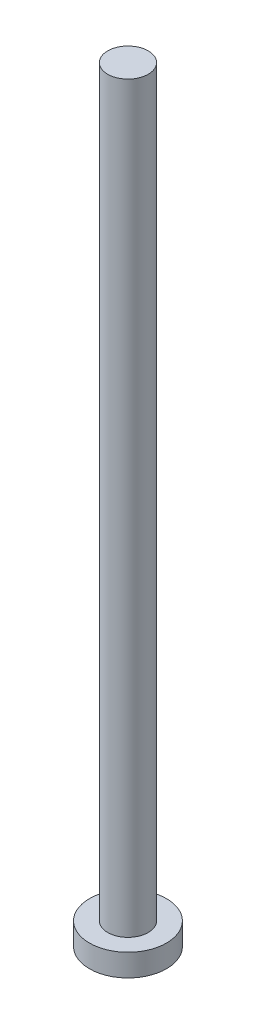
ISO-10303-21;
HEADER;
FILE_DESCRIPTION(('STEP AP214'),'2;1');
FILE_NAME('part.step','',(''),(''),'','','');
FILE_SCHEMA(('AUTOMOTIVE_DESIGN { 1 0 10303 214 1 1 1 1 }'));
ENDSEC;
DATA;
#1=APPLICATION_CONTEXT('core data for automotive mechanical design processes');
#2=APPLICATION_PROTOCOL_DEFINITION('international standard','automotive_design',2000,#1);
#3=PRODUCT_CONTEXT('',#1,'mechanical');
#4=PRODUCT('Part','Part','',(#3));
#5=PRODUCT_RELATED_PRODUCT_CATEGORY('part','',(#4));
#6=PRODUCT_DEFINITION_FORMATION('','',#4);
#7=PRODUCT_DEFINITION_CONTEXT('part definition',#1,'design');
#8=PRODUCT_DEFINITION('design','',#6,#7);
#9=PRODUCT_DEFINITION_SHAPE('','',#8);
#10=(LENGTH_UNIT() NAMED_UNIT(*) SI_UNIT(.MILLI.,.METRE.));
#11=(NAMED_UNIT(*) PLANE_ANGLE_UNIT() SI_UNIT($,.RADIAN.));
#12=(NAMED_UNIT(*) SI_UNIT($,.STERADIAN.) SOLID_ANGLE_UNIT());
#13=UNCERTAINTY_MEASURE_WITH_UNIT(LENGTH_MEASURE(1.E-05),#10,'distance_accuracy_value','');
#14=(GEOMETRIC_REPRESENTATION_CONTEXT(3) GLOBAL_UNCERTAINTY_ASSIGNED_CONTEXT((#13)) GLOBAL_UNIT_ASSIGNED_CONTEXT((#10,
#11,#12)) REPRESENTATION_CONTEXT('',''));
#15=CARTESIAN_POINT('',(0.,0.,0.));
#16=DIRECTION('',(0.,0.,1.));
#17=DIRECTION('',(1.,0.,0.));
#18=AXIS2_PLACEMENT_3D('',#15,#16,#17);
#19=CARTESIAN_POINT('',(0.,1.65,0.));
#20=DIRECTION('',(0.,-1.,0.));
#21=DIRECTION('',(0.,0.,-1.));
#22=AXIS2_PLACEMENT_3D('',#19,#20,#21);
#23=CYLINDRICAL_SURFACE('',#22,2.85);
#24=CARTESIAN_POINT('',(0.,1.65,0.));
#25=DIRECTION('',(0.,1.,0.));
#26=DIRECTION('',(0.,0.,1.));
#27=AXIS2_PLACEMENT_3D('',#24,#25,#26);
#28=CIRCLE('',#27,2.85);
#29=CARTESIAN_POINT('',(0.,1.65,2.85));
#30=VERTEX_POINT('',#29);
#31=EDGE_CURVE('E10',#30,#30,#28,.T.);
#32=ORIENTED_EDGE('',*,*,#31,.F.);
#33=EDGE_LOOP('',(#32));
#34=FACE_BOUND('',#33,.T.);
#35=CARTESIAN_POINT('',(0.,0.,0.));
#36=DIRECTION('',(0.,1.,0.));
#37=DIRECTION('',(0.,0.,1.));
#38=AXIS2_PLACEMENT_3D('',#35,#36,#37);
#39=CIRCLE('',#38,2.85);
#40=CARTESIAN_POINT('',(0.,0.,2.85));
#41=VERTEX_POINT('',#40);
#42=EDGE_CURVE('E36',#41,#41,#39,.T.);
#43=ORIENTED_EDGE('',*,*,#42,.T.);
#44=EDGE_LOOP('',(#43));
#45=FACE_BOUND('',#44,.T.);
#46=ADVANCED_FACE('F33',(#34,#45),#23,.T.);
#47=CARTESIAN_POINT('',(0.,1.65,0.));
#48=DIRECTION('',(0.,1.,0.));
#49=DIRECTION('',(0.,0.,1.));
#50=AXIS2_PLACEMENT_3D('',#47,#48,#49);
#51=PLANE('',#50);
#52=CARTESIAN_POINT('',(0.,1.65,0.));
#53=DIRECTION('',(0.,1.,0.));
#54=DIRECTION('',(0.,0.,1.));
#55=AXIS2_PLACEMENT_3D('',#52,#53,#54);
#56=CIRCLE('',#55,1.5);
#57=CARTESIAN_POINT('',(0.,1.65,1.5));
#58=VERTEX_POINT('',#57);
#59=EDGE_CURVE('E45',#58,#58,#56,.T.);
#60=ORIENTED_EDGE('',*,*,#59,.F.);
#61=EDGE_LOOP('',(#60));
#62=FACE_BOUND('',#61,.T.);
#63=ORIENTED_EDGE('',*,*,#31,.T.);
#64=EDGE_LOOP('',(#63));
#65=FACE_BOUND('',#64,.T.);
#66=ADVANCED_FACE('F60',(#62,#65),#51,.T.);
#67=CARTESIAN_POINT('',(0.,0.,0.));
#68=DIRECTION('',(0.,1.,0.));
#69=DIRECTION('',(0.,0.,1.));
#70=AXIS2_PLACEMENT_3D('',#67,#68,#69);
#71=PLANE('',#70);
#72=ORIENTED_EDGE('',*,*,#42,.F.);
#73=EDGE_LOOP('',(#72));
#74=FACE_BOUND('',#73,.T.);
#75=ADVANCED_FACE('F56',(#74),#71,.F.);
#76=CARTESIAN_POINT('',(0.,56.65,0.));
#77=DIRECTION('',(0.,-1.,0.));
#78=DIRECTION('',(0.,0.,-1.));
#79=AXIS2_PLACEMENT_3D('',#76,#77,#78);
#80=CYLINDRICAL_SURFACE('',#79,1.5);
#81=CARTESIAN_POINT('',(0.,56.65,0.));
#82=DIRECTION('',(0.,1.,0.));
#83=DIRECTION('',(0.,0.,1.));
#84=AXIS2_PLACEMENT_3D('',#81,#82,#83);
#85=CIRCLE('',#84,1.5);
#86=CARTESIAN_POINT('',(0.,56.65,1.5));
#87=VERTEX_POINT('',#86);
#88=EDGE_CURVE('E43',#87,#87,#85,.T.);
#89=ORIENTED_EDGE('',*,*,#88,.F.);
#90=EDGE_LOOP('',(#89));
#91=FACE_BOUND('',#90,.T.);
#92=ORIENTED_EDGE('',*,*,#59,.T.);
#93=EDGE_LOOP('',(#92));
#94=FACE_BOUND('',#93,.T.);
#95=ADVANCED_FACE('F53',(#91,#94),#80,.T.);
#96=CARTESIAN_POINT('',(0.,56.65,0.));
#97=DIRECTION('',(0.,1.,0.));
#98=DIRECTION('',(0.,0.,1.));
#99=AXIS2_PLACEMENT_3D('',#96,#97,#98);
#100=PLANE('',#99);
#101=ORIENTED_EDGE('',*,*,#88,.T.);
#102=EDGE_LOOP('',(#101));
#103=FACE_BOUND('',#102,.T.);
#104=ADVANCED_FACE('F51',(#103),#100,.T.);
#105=CLOSED_SHELL('',(#46,#66,#75,#95,#104));
#106=MANIFOLD_SOLID_BREP('B2',#105);
#107=ADVANCED_BREP_SHAPE_REPRESENTATION('',(#18,#106),#14);
#108=SHAPE_DEFINITION_REPRESENTATION(#9,#107);
ENDSEC;
END-ISO-10303-21;
